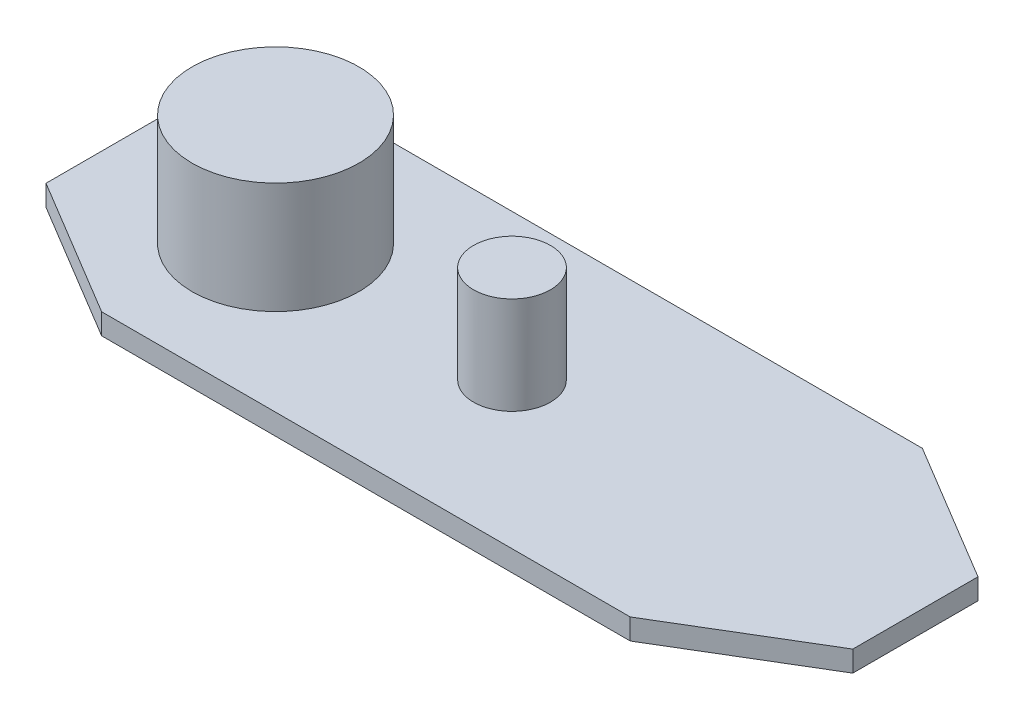
ISO-10303-21;
HEADER;
FILE_DESCRIPTION(('STEP AP214'),'2;1');
FILE_NAME('part.step','',(''),(''),'','','');
FILE_SCHEMA(('AUTOMOTIVE_DESIGN { 1 0 10303 214 1 1 1 1 }'));
ENDSEC;
DATA;
#1=APPLICATION_CONTEXT('core data for automotive mechanical design processes');
#2=APPLICATION_PROTOCOL_DEFINITION('international standard','automotive_design',2000,#1);
#3=PRODUCT_CONTEXT('',#1,'mechanical');
#4=PRODUCT('Part','Part','',(#3));
#5=PRODUCT_RELATED_PRODUCT_CATEGORY('part','',(#4));
#6=PRODUCT_DEFINITION_FORMATION('','',#4);
#7=PRODUCT_DEFINITION_CONTEXT('part definition',#1,'design');
#8=PRODUCT_DEFINITION('design','',#6,#7);
#9=PRODUCT_DEFINITION_SHAPE('','',#8);
#10=(LENGTH_UNIT() NAMED_UNIT(*) SI_UNIT(.MILLI.,.METRE.));
#11=(NAMED_UNIT(*) PLANE_ANGLE_UNIT() SI_UNIT($,.RADIAN.));
#12=(NAMED_UNIT(*) SI_UNIT($,.STERADIAN.) SOLID_ANGLE_UNIT());
#13=UNCERTAINTY_MEASURE_WITH_UNIT(LENGTH_MEASURE(1.E-05),#10,'distance_accuracy_value','');
#14=(GEOMETRIC_REPRESENTATION_CONTEXT(3) GLOBAL_UNCERTAINTY_ASSIGNED_CONTEXT((#13)) GLOBAL_UNIT_ASSIGNED_CONTEXT((#10,
#11,#12)) REPRESENTATION_CONTEXT('',''));
#15=CARTESIAN_POINT('',(0.,0.,0.));
#16=DIRECTION('',(0.,0.,1.));
#17=DIRECTION('',(1.,0.,0.));
#18=AXIS2_PLACEMENT_3D('',#15,#16,#17);
#19=CARTESIAN_POINT('',(-19.,1.5,-10.5));
#20=DIRECTION('',(0.514495755427527,0.,0.857492925712544));
#21=DIRECTION('',(0.857492925712544,0.,-0.514495755427527));
#22=AXIS2_PLACEMENT_3D('',#19,#20,#21);
#23=PLANE('',#22);
#24=DIRECTION('',(-0.857492925712544,0.,0.514495755427526));
#25=VECTOR('',#24,1.);
#26=CARTESIAN_POINT('',(-19.,0.,-10.5));
#27=LINE('',#26,#25);
#28=CARTESIAN_POINT('',(-19.,0.,-10.5));
#29=VERTEX_POINT('',#28);
#30=CARTESIAN_POINT('',(-29.,0.,-4.50000000000001));
#31=VERTEX_POINT('',#30);
#32=EDGE_CURVE('E132',#29,#31,#27,.T.);
#33=ORIENTED_EDGE('',*,*,#32,.T.);
#34=DIRECTION('',(0.,-1.,0.));
#35=VECTOR('',#34,1.);
#36=CARTESIAN_POINT('',(-29.,1.5,-4.50000000000001));
#37=LINE('',#36,#35);
#38=CARTESIAN_POINT('',(-29.,1.5,-4.50000000000001));
#39=VERTEX_POINT('',#38);
#40=EDGE_CURVE('E159',#39,#31,#37,.T.);
#41=ORIENTED_EDGE('',*,*,#40,.F.);
#42=DIRECTION('',(-0.857492925712544,0.,0.514495755427526));
#43=VECTOR('',#42,1.);
#44=CARTESIAN_POINT('',(-19.,1.5,-10.5));
#45=LINE('',#44,#43);
#46=CARTESIAN_POINT('',(-19.,1.5,-10.5));
#47=VERTEX_POINT('',#46);
#48=EDGE_CURVE('E147',#47,#39,#45,.T.);
#49=ORIENTED_EDGE('',*,*,#48,.F.);
#50=DIRECTION('',(0.,-1.,0.));
#51=VECTOR('',#50,1.);
#52=CARTESIAN_POINT('',(-19.,1.5,-10.5));
#53=LINE('',#52,#51);
#54=EDGE_CURVE('E128',#47,#29,#53,.T.);
#55=ORIENTED_EDGE('',*,*,#54,.T.);
#56=EDGE_LOOP('',(#33,#41,#49,#55));
#57=FACE_BOUND('',#56,.T.);
#58=ADVANCED_FACE('F35',(#57),#23,.F.);
#59=CARTESIAN_POINT('',(-29.,1.5,-4.50000000000001));
#60=DIRECTION('',(1.,0.,0.));
#61=DIRECTION('',(0.,0.,-1.));
#62=AXIS2_PLACEMENT_3D('',#59,#60,#61);
#63=PLANE('',#62);
#64=DIRECTION('',(0.,0.,1.));
#65=VECTOR('',#64,1.);
#66=CARTESIAN_POINT('',(-29.,0.,-4.50000000000001));
#67=LINE('',#66,#65);
#68=CARTESIAN_POINT('',(-29.,0.,4.5));
#69=VERTEX_POINT('',#68);
#70=EDGE_CURVE('E135',#31,#69,#67,.T.);
#71=ORIENTED_EDGE('',*,*,#70,.T.);
#72=DIRECTION('',(0.,-1.,0.));
#73=VECTOR('',#72,1.);
#74=CARTESIAN_POINT('',(-29.,1.5,4.5));
#75=LINE('',#74,#73);
#76=CARTESIAN_POINT('',(-29.,1.5,4.5));
#77=VERTEX_POINT('',#76);
#78=EDGE_CURVE('E157',#77,#69,#75,.T.);
#79=ORIENTED_EDGE('',*,*,#78,.F.);
#80=DIRECTION('',(0.,0.,1.));
#81=VECTOR('',#80,1.);
#82=CARTESIAN_POINT('',(-29.,1.5,-4.50000000000001));
#83=LINE('',#82,#81);
#84=EDGE_CURVE('E95',#39,#77,#83,.T.);
#85=ORIENTED_EDGE('',*,*,#84,.F.);
#86=ORIENTED_EDGE('',*,*,#40,.T.);
#87=EDGE_LOOP('',(#71,#79,#85,#86));
#88=FACE_BOUND('',#87,.T.);
#89=ADVANCED_FACE('F201',(#88),#63,.F.);
#90=CARTESIAN_POINT('',(-19.,1.5,10.5));
#91=DIRECTION('',(0.514495755427527,0.,-0.857492925712544));
#92=DIRECTION('',(-0.857492925712544,0.,-0.514495755427527));
#93=AXIS2_PLACEMENT_3D('',#90,#91,#92);
#94=PLANE('',#93);
#95=DIRECTION('',(0.857492925712544,0.,0.514495755427527));
#96=VECTOR('',#95,1.);
#97=CARTESIAN_POINT('',(-19.,0.,10.5));
#98=LINE('',#97,#96);
#99=CARTESIAN_POINT('',(-19.,0.,10.5));
#100=VERTEX_POINT('',#99);
#101=EDGE_CURVE('E138',#69,#100,#98,.T.);
#102=ORIENTED_EDGE('',*,*,#101,.T.);
#103=DIRECTION('',(0.,-1.,0.));
#104=VECTOR('',#103,1.);
#105=CARTESIAN_POINT('',(-19.,1.5,10.5));
#106=LINE('',#105,#104);
#107=CARTESIAN_POINT('',(-19.,1.5,10.5));
#108=VERTEX_POINT('',#107);
#109=EDGE_CURVE('E154',#108,#100,#106,.T.);
#110=ORIENTED_EDGE('',*,*,#109,.F.);
#111=DIRECTION('',(0.857492925712544,0.,0.514495755427527));
#112=VECTOR('',#111,1.);
#113=CARTESIAN_POINT('',(-19.,1.5,10.5));
#114=LINE('',#113,#112);
#115=EDGE_CURVE('E170',#77,#108,#114,.T.);
#116=ORIENTED_EDGE('',*,*,#115,.F.);
#117=ORIENTED_EDGE('',*,*,#78,.T.);
#118=EDGE_LOOP('',(#102,#110,#116,#117));
#119=FACE_BOUND('',#118,.T.);
#120=ADVANCED_FACE('F205',(#119),#94,.F.);
#121=CARTESIAN_POINT('',(-19.,1.5,10.5));
#122=DIRECTION('',(0.,0.,-1.));
#123=DIRECTION('',(-1.,0.,0.));
#124=AXIS2_PLACEMENT_3D('',#121,#122,#123);
#125=PLANE('',#124);
#126=DIRECTION('',(1.,0.,0.));
#127=VECTOR('',#126,1.);
#128=CARTESIAN_POINT('',(-19.,0.,10.5));
#129=LINE('',#128,#127);
#130=CARTESIAN_POINT('',(19.,0.,10.5));
#131=VERTEX_POINT('',#130);
#132=EDGE_CURVE('E140',#100,#131,#129,.T.);
#133=ORIENTED_EDGE('',*,*,#132,.T.);
#134=DIRECTION('',(0.,-1.,0.));
#135=VECTOR('',#134,1.);
#136=CARTESIAN_POINT('',(19.,1.5,10.5));
#137=LINE('',#136,#135);
#138=CARTESIAN_POINT('',(19.,1.5,10.5));
#139=VERTEX_POINT('',#138);
#140=EDGE_CURVE('E151',#139,#131,#137,.T.);
#141=ORIENTED_EDGE('',*,*,#140,.F.);
#142=DIRECTION('',(1.,0.,0.));
#143=VECTOR('',#142,1.);
#144=CARTESIAN_POINT('',(-19.,1.5,10.5));
#145=LINE('',#144,#143);
#146=EDGE_CURVE('E172',#108,#139,#145,.T.);
#147=ORIENTED_EDGE('',*,*,#146,.F.);
#148=ORIENTED_EDGE('',*,*,#109,.T.);
#149=EDGE_LOOP('',(#133,#141,#147,#148));
#150=FACE_BOUND('',#149,.T.);
#151=ADVANCED_FACE('F178',(#150),#125,.F.);
#152=CARTESIAN_POINT('',(19.,1.5,10.5));
#153=DIRECTION('',(-0.514495755427525,0.,-0.857492925712545));
#154=DIRECTION('',(-0.857492925712545,0.,0.514495755427525));
#155=AXIS2_PLACEMENT_3D('',#152,#153,#154);
#156=PLANE('',#155);
#157=DIRECTION('',(0.857492925712545,0.,-0.514495755427525));
#158=VECTOR('',#157,1.);
#159=CARTESIAN_POINT('',(19.,0.,10.5));
#160=LINE('',#159,#158);
#161=CARTESIAN_POINT('',(29.,0.,4.50000000000001));
#162=VERTEX_POINT('',#161);
#163=EDGE_CURVE('E142',#131,#162,#160,.T.);
#164=ORIENTED_EDGE('',*,*,#163,.T.);
#165=DIRECTION('',(0.,-1.,0.));
#166=VECTOR('',#165,1.);
#167=CARTESIAN_POINT('',(29.,1.5,4.50000000000001));
#168=LINE('',#167,#166);
#169=CARTESIAN_POINT('',(29.,1.5,4.50000000000001));
#170=VERTEX_POINT('',#169);
#171=EDGE_CURVE('E123',#170,#162,#168,.T.);
#172=ORIENTED_EDGE('',*,*,#171,.F.);
#173=DIRECTION('',(0.857492925712545,0.,-0.514495755427525));
#174=VECTOR('',#173,1.);
#175=CARTESIAN_POINT('',(19.,1.5,10.5));
#176=LINE('',#175,#174);
#177=EDGE_CURVE('E114',#139,#170,#176,.T.);
#178=ORIENTED_EDGE('',*,*,#177,.F.);
#179=ORIENTED_EDGE('',*,*,#140,.T.);
#180=EDGE_LOOP('',(#164,#172,#178,#179));
#181=FACE_BOUND('',#180,.T.);
#182=ADVANCED_FACE('F182',(#181),#156,.F.);
#183=CARTESIAN_POINT('',(29.,1.5,-4.49999999999999));
#184=DIRECTION('',(-1.,0.,0.));
#185=DIRECTION('',(0.,0.,1.));
#186=AXIS2_PLACEMENT_3D('',#183,#184,#185);
#187=PLANE('',#186);
#188=DIRECTION('',(0.,0.,-1.));
#189=VECTOR('',#188,1.);
#190=CARTESIAN_POINT('',(29.,0.,-4.49999999999999));
#191=LINE('',#190,#189);
#192=CARTESIAN_POINT('',(29.,0.,-4.49999999999999));
#193=VERTEX_POINT('',#192);
#194=EDGE_CURVE('E122',#162,#193,#191,.T.);
#195=ORIENTED_EDGE('',*,*,#194,.T.);
#196=DIRECTION('',(0.,-1.,0.));
#197=VECTOR('',#196,1.);
#198=CARTESIAN_POINT('',(29.,1.5,-4.49999999999999));
#199=LINE('',#198,#197);
#200=CARTESIAN_POINT('',(29.,1.5,-4.49999999999999));
#201=VERTEX_POINT('',#200);
#202=EDGE_CURVE('E119',#201,#193,#199,.T.);
#203=ORIENTED_EDGE('',*,*,#202,.F.);
#204=DIRECTION('',(0.,0.,-1.));
#205=VECTOR('',#204,1.);
#206=CARTESIAN_POINT('',(29.,1.5,-4.49999999999999));
#207=LINE('',#206,#205);
#208=EDGE_CURVE('E108',#170,#201,#207,.T.);
#209=ORIENTED_EDGE('',*,*,#208,.F.);
#210=ORIENTED_EDGE('',*,*,#171,.T.);
#211=EDGE_LOOP('',(#195,#203,#209,#210));
#212=FACE_BOUND('',#211,.T.);
#213=ADVANCED_FACE('F120',(#212),#187,.F.);
#214=CARTESIAN_POINT('',(19.,1.5,-10.5));
#215=DIRECTION('',(-0.514495755427527,0.,0.857492925712544));
#216=DIRECTION('',(0.857492925712544,0.,0.514495755427527));
#217=AXIS2_PLACEMENT_3D('',#214,#215,#216);
#218=PLANE('',#217);
#219=DIRECTION('',(-0.857492925712544,0.,-0.514495755427527));
#220=VECTOR('',#219,1.);
#221=CARTESIAN_POINT('',(19.,0.,-10.5));
#222=LINE('',#221,#220);
#223=CARTESIAN_POINT('',(19.,0.,-10.5));
#224=VERTEX_POINT('',#223);
#225=EDGE_CURVE('E80',#193,#224,#222,.T.);
#226=ORIENTED_EDGE('',*,*,#225,.T.);
#227=DIRECTION('',(0.,-1.,0.));
#228=VECTOR('',#227,1.);
#229=CARTESIAN_POINT('',(19.,1.5,-10.5));
#230=LINE('',#229,#228);
#231=CARTESIAN_POINT('',(19.,1.5,-10.5));
#232=VERTEX_POINT('',#231);
#233=EDGE_CURVE('E124',#232,#224,#230,.T.);
#234=ORIENTED_EDGE('',*,*,#233,.F.);
#235=DIRECTION('',(-0.857492925712544,0.,-0.514495755427527));
#236=VECTOR('',#235,1.);
#237=CARTESIAN_POINT('',(19.,1.5,-10.5));
#238=LINE('',#237,#236);
#239=EDGE_CURVE('E112',#201,#232,#238,.T.);
#240=ORIENTED_EDGE('',*,*,#239,.F.);
#241=ORIENTED_EDGE('',*,*,#202,.T.);
#242=EDGE_LOOP('',(#226,#234,#240,#241));
#243=FACE_BOUND('',#242,.T.);
#244=ADVANCED_FACE('F126',(#243),#218,.F.);
#245=CARTESIAN_POINT('',(-19.,1.5,-10.5));
#246=DIRECTION('',(0.,0.,1.));
#247=DIRECTION('',(1.,0.,0.));
#248=AXIS2_PLACEMENT_3D('',#245,#246,#247);
#249=PLANE('',#248);
#250=DIRECTION('',(-1.,0.,0.));
#251=VECTOR('',#250,1.);
#252=CARTESIAN_POINT('',(-19.,0.,-10.5));
#253=LINE('',#252,#251);
#254=EDGE_CURVE('E86',#224,#29,#253,.T.);
#255=ORIENTED_EDGE('',*,*,#254,.T.);
#256=ORIENTED_EDGE('',*,*,#54,.F.);
#257=DIRECTION('',(-1.,0.,0.));
#258=VECTOR('',#257,1.);
#259=CARTESIAN_POINT('',(-19.,1.5,-10.5));
#260=LINE('',#259,#258);
#261=EDGE_CURVE('E51',#232,#47,#260,.T.);
#262=ORIENTED_EDGE('',*,*,#261,.F.);
#263=ORIENTED_EDGE('',*,*,#233,.T.);
#264=EDGE_LOOP('',(#255,#256,#262,#263));
#265=FACE_BOUND('',#264,.T.);
#266=ADVANCED_FACE('F189',(#265),#249,.F.);
#267=CARTESIAN_POINT('',(0.,1.5,0.));
#268=DIRECTION('',(0.,-1.,0.));
#269=DIRECTION('',(0.,0.,-1.));
#270=AXIS2_PLACEMENT_3D('',#267,#268,#269);
#271=PLANE('',#270);
#272=CARTESIAN_POINT('',(0.,1.5,0.));
#273=DIRECTION('',(0.,-1.,0.));
#274=DIRECTION('',(0.,0.,-1.));
#275=AXIS2_PLACEMENT_3D('',#272,#273,#274);
#276=CIRCLE('',#275,2.76405534238861);
#277=CARTESIAN_POINT('',(0.,1.5,-2.76405534238861));
#278=VERTEX_POINT('',#277);
#279=EDGE_CURVE('E11',#278,#278,#276,.F.);
#280=ORIENTED_EDGE('',*,*,#279,.F.);
#281=EDGE_LOOP('',(#280));
#282=FACE_BOUND('',#281,.T.);
#283=CARTESIAN_POINT('',(-17.,1.5,0.));
#284=DIRECTION('',(0.,1.,0.));
#285=DIRECTION('',(0.,0.,1.));
#286=AXIS2_PLACEMENT_3D('',#283,#284,#285);
#287=CIRCLE('',#286,6.);
#288=CARTESIAN_POINT('',(-17.,1.5,6.));
#289=VERTEX_POINT('',#288);
#290=EDGE_CURVE('E43',#289,#289,#287,.T.);
#291=ORIENTED_EDGE('',*,*,#290,.F.);
#292=EDGE_LOOP('',(#291));
#293=FACE_BOUND('',#292,.T.);
#294=ORIENTED_EDGE('',*,*,#48,.T.);
#295=ORIENTED_EDGE('',*,*,#84,.T.);
#296=ORIENTED_EDGE('',*,*,#115,.T.);
#297=ORIENTED_EDGE('',*,*,#146,.T.);
#298=ORIENTED_EDGE('',*,*,#177,.T.);
#299=ORIENTED_EDGE('',*,*,#208,.T.);
#300=ORIENTED_EDGE('',*,*,#239,.T.);
#301=ORIENTED_EDGE('',*,*,#261,.T.);
#302=EDGE_LOOP('',(#294,#295,#296,#297,#298,#299,#300,#301));
#303=FACE_BOUND('',#302,.T.);
#304=ADVANCED_FACE('F110',(#282,#293,#303),#271,.F.);
#305=CARTESIAN_POINT('',(0.,0.,0.));
#306=DIRECTION('',(0.,-1.,0.));
#307=DIRECTION('',(0.,0.,-1.));
#308=AXIS2_PLACEMENT_3D('',#305,#306,#307);
#309=PLANE('',#308);
#310=ORIENTED_EDGE('',*,*,#32,.F.);
#311=ORIENTED_EDGE('',*,*,#254,.F.);
#312=ORIENTED_EDGE('',*,*,#225,.F.);
#313=ORIENTED_EDGE('',*,*,#194,.F.);
#314=ORIENTED_EDGE('',*,*,#163,.F.);
#315=ORIENTED_EDGE('',*,*,#132,.F.);
#316=ORIENTED_EDGE('',*,*,#101,.F.);
#317=ORIENTED_EDGE('',*,*,#70,.F.);
#318=EDGE_LOOP('',(#310,#311,#312,#313,#314,#315,#316,#317));
#319=FACE_BOUND('',#318,.T.);
#320=ADVANCED_FACE('F185',(#319),#309,.T.);
#321=CARTESIAN_POINT('',(-17.,9.5,0.));
#322=DIRECTION('',(0.,-1.,0.));
#323=DIRECTION('',(0.,0.,-1.));
#324=AXIS2_PLACEMENT_3D('',#321,#322,#323);
#325=CYLINDRICAL_SURFACE('',#324,6.);
#326=CARTESIAN_POINT('',(-17.,9.5,0.));
#327=DIRECTION('',(0.,1.,0.));
#328=DIRECTION('',(0.,0.,1.));
#329=AXIS2_PLACEMENT_3D('',#326,#327,#328);
#330=CIRCLE('',#329,6.);
#331=CARTESIAN_POINT('',(-17.,9.5,6.));
#332=VERTEX_POINT('',#331);
#333=EDGE_CURVE('E136',#332,#332,#330,.T.);
#334=ORIENTED_EDGE('',*,*,#333,.F.);
#335=EDGE_LOOP('',(#334));
#336=FACE_BOUND('',#335,.T.);
#337=ORIENTED_EDGE('',*,*,#290,.T.);
#338=EDGE_LOOP('',(#337));
#339=FACE_BOUND('',#338,.T.);
#340=ADVANCED_FACE('F239',(#336,#339),#325,.T.);
#341=CARTESIAN_POINT('',(-17.,9.5,0.));
#342=DIRECTION('',(0.,1.,0.));
#343=DIRECTION('',(0.,0.,1.));
#344=AXIS2_PLACEMENT_3D('',#341,#342,#343);
#345=PLANE('',#344);
#346=ORIENTED_EDGE('',*,*,#333,.T.);
#347=EDGE_LOOP('',(#346));
#348=FACE_BOUND('',#347,.T.);
#349=ADVANCED_FACE('F248',(#348),#345,.T.);
#350=CARTESIAN_POINT('',(0.,8.5,0.));
#351=DIRECTION('',(0.,-1.,0.));
#352=DIRECTION('',(0.,0.,-1.));
#353=AXIS2_PLACEMENT_3D('',#350,#351,#352);
#354=CYLINDRICAL_SURFACE('',#353,2.76405534238861);
#355=CARTESIAN_POINT('',(0.,8.5,0.));
#356=DIRECTION('',(0.,1.,0.));
#357=DIRECTION('',(0.,0.,1.));
#358=AXIS2_PLACEMENT_3D('',#355,#356,#357);
#359=CIRCLE('',#358,2.76405534238861);
#360=CARTESIAN_POINT('',(0.,8.5,2.76405534238861));
#361=VERTEX_POINT('',#360);
#362=EDGE_CURVE('E290',#361,#361,#359,.T.);
#363=ORIENTED_EDGE('',*,*,#362,.F.);
#364=EDGE_LOOP('',(#363));
#365=FACE_BOUND('',#364,.T.);
#366=ORIENTED_EDGE('',*,*,#279,.T.);
#367=EDGE_LOOP('',(#366));
#368=FACE_BOUND('',#367,.T.);
#369=ADVANCED_FACE('F259',(#365,#368),#354,.T.);
#370=CARTESIAN_POINT('',(0.,8.5,0.));
#371=DIRECTION('',(0.,1.,0.));
#372=DIRECTION('',(0.,0.,1.));
#373=AXIS2_PLACEMENT_3D('',#370,#371,#372);
#374=PLANE('',#373);
#375=ORIENTED_EDGE('',*,*,#362,.T.);
#376=EDGE_LOOP('',(#375));
#377=FACE_BOUND('',#376,.T.);
#378=ADVANCED_FACE('F274',(#377),#374,.T.);
#379=CLOSED_SHELL('',(#58,#89,#120,#151,#182,#213,#244,#266,#304,#320,#340,#349,#369,#378));
#380=MANIFOLD_SOLID_BREP('B2',#379);
#381=ADVANCED_BREP_SHAPE_REPRESENTATION('',(#18,#380),#14);
#382=SHAPE_DEFINITION_REPRESENTATION(#9,#381);
ENDSEC;
END-ISO-10303-21;
